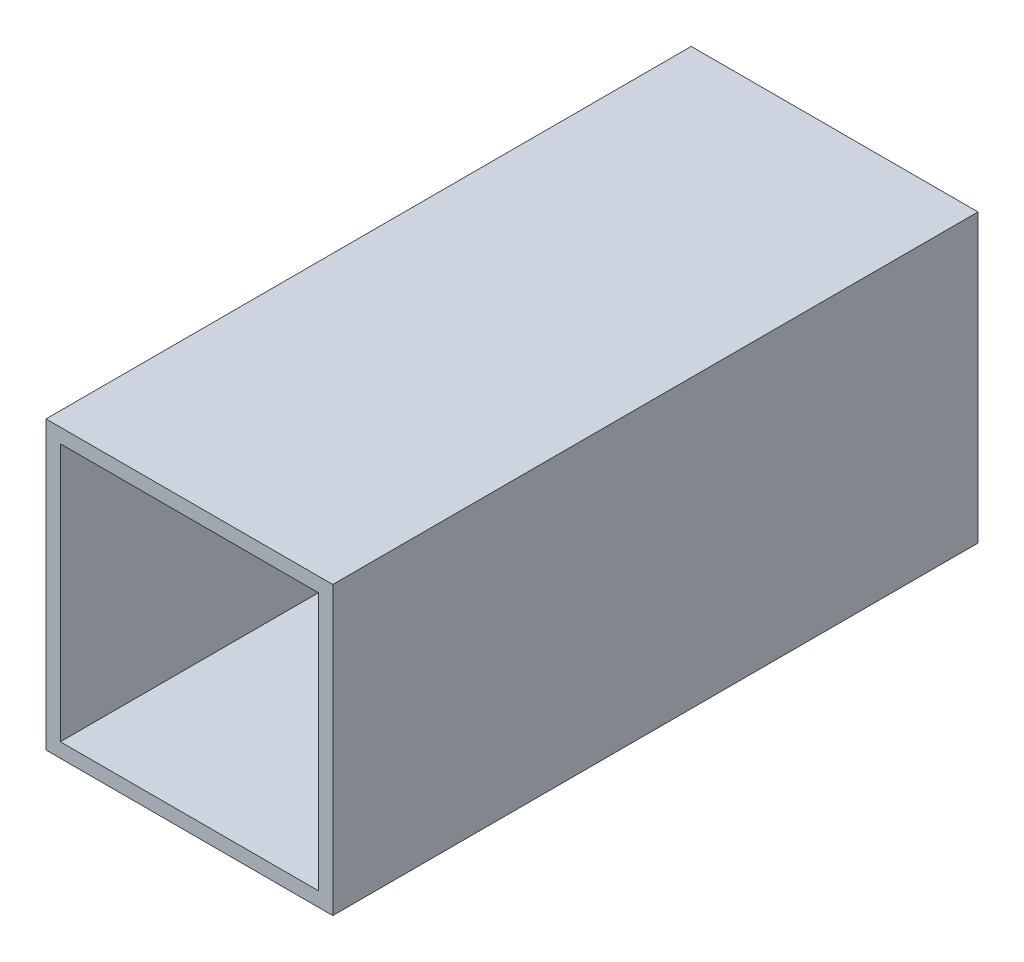
ISO-10303-21;
HEADER;
FILE_DESCRIPTION(('STEP AP214'),'2;1');
FILE_NAME('part.step','',(''),(''),'','','');
FILE_SCHEMA(('AUTOMOTIVE_DESIGN { 1 0 10303 214 1 1 1 1 }'));
ENDSEC;
DATA;
#1=APPLICATION_CONTEXT('core data for automotive mechanical design processes');
#2=APPLICATION_PROTOCOL_DEFINITION('international standard','automotive_design',2000,#1);
#3=PRODUCT_CONTEXT('',#1,'mechanical');
#4=PRODUCT('Part','Part','',(#3));
#5=PRODUCT_RELATED_PRODUCT_CATEGORY('part','',(#4));
#6=PRODUCT_DEFINITION_FORMATION('','',#4);
#7=PRODUCT_DEFINITION_CONTEXT('part definition',#1,'design');
#8=PRODUCT_DEFINITION('design','',#6,#7);
#9=PRODUCT_DEFINITION_SHAPE('','',#8);
#10=(LENGTH_UNIT() NAMED_UNIT(*) SI_UNIT(.MILLI.,.METRE.));
#11=(NAMED_UNIT(*) PLANE_ANGLE_UNIT() SI_UNIT($,.RADIAN.));
#12=(NAMED_UNIT(*) SI_UNIT($,.STERADIAN.) SOLID_ANGLE_UNIT());
#13=UNCERTAINTY_MEASURE_WITH_UNIT(LENGTH_MEASURE(1.E-05),#10,'distance_accuracy_value','');
#14=(GEOMETRIC_REPRESENTATION_CONTEXT(3) GLOBAL_UNCERTAINTY_ASSIGNED_CONTEXT((#13)) GLOBAL_UNIT_ASSIGNED_CONTEXT((#10,
#11,#12)) REPRESENTATION_CONTEXT('',''));
#15=CARTESIAN_POINT('',(0.,0.,0.));
#16=DIRECTION('',(0.,0.,1.));
#17=DIRECTION('',(1.,0.,0.));
#18=AXIS2_PLACEMENT_3D('',#15,#16,#17);
#19=CARTESIAN_POINT('',(0.,0.,114.3));
#20=DIRECTION('',(0.,0.,-1.));
#21=DIRECTION('',(-1.,0.,0.));
#22=AXIS2_PLACEMENT_3D('',#19,#20,#21);
#23=PLANE('',#22);
#24=DIRECTION('',(0.,-1.,0.));
#25=VECTOR('',#24,1.);
#26=CARTESIAN_POINT('',(1.63285714285714,0.,114.3));
#27=LINE('',#26,#25);
#28=CARTESIAN_POINT('',(1.63285714285714,50.8,114.3));
#29=VERTEX_POINT('',#28);
#30=CARTESIAN_POINT('',(1.63285714285714,0.,114.3));
#31=VERTEX_POINT('',#30);
#32=EDGE_CURVE('E134',#29,#31,#27,.T.);
#33=ORIENTED_EDGE('',*,*,#32,.T.);
#34=DIRECTION('',(1.,0.,0.));
#35=VECTOR('',#34,1.);
#36=CARTESIAN_POINT('',(1.63285714285714,0.,114.3));
#37=LINE('',#36,#35);
#38=CARTESIAN_POINT('',(52.4328571428571,0.,114.3));
#39=VERTEX_POINT('',#38);
#40=EDGE_CURVE('E137',#31,#39,#37,.T.);
#41=ORIENTED_EDGE('',*,*,#40,.T.);
#42=DIRECTION('',(0.,1.,0.));
#43=VECTOR('',#42,1.);
#44=CARTESIAN_POINT('',(52.4328571428571,0.,114.3));
#45=LINE('',#44,#43);
#46=CARTESIAN_POINT('',(52.4328571428571,50.8,114.3));
#47=VERTEX_POINT('',#46);
#48=EDGE_CURVE('E140',#39,#47,#45,.T.);
#49=ORIENTED_EDGE('',*,*,#48,.T.);
#50=DIRECTION('',(-1.,0.,0.));
#51=VECTOR('',#50,1.);
#52=CARTESIAN_POINT('',(1.63285714285714,50.8,114.3));
#53=LINE('',#52,#51);
#54=EDGE_CURVE('E142',#47,#29,#53,.T.);
#55=ORIENTED_EDGE('',*,*,#54,.T.);
#56=EDGE_LOOP('',(#33,#41,#49,#55));
#57=FACE_BOUND('',#56,.T.);
#58=DIRECTION('',(0.,-1.,0.));
#59=VECTOR('',#58,1.);
#60=CARTESIAN_POINT('',(4.17285714285714,2.54,114.3));
#61=LINE('',#60,#59);
#62=CARTESIAN_POINT('',(4.17285714285714,48.26,114.3));
#63=VERTEX_POINT('',#62);
#64=CARTESIAN_POINT('',(4.17285714285714,2.54,114.3));
#65=VERTEX_POINT('',#64);
#66=EDGE_CURVE('E98',#63,#65,#61,.T.);
#67=ORIENTED_EDGE('',*,*,#66,.F.);
#68=DIRECTION('',(-1.,0.,0.));
#69=VECTOR('',#68,1.);
#70=CARTESIAN_POINT('',(4.17285714285714,48.26,114.3));
#71=LINE('',#70,#69);
#72=CARTESIAN_POINT('',(49.8928571428571,48.26,114.3));
#73=VERTEX_POINT('',#72);
#74=EDGE_CURVE('E120',#73,#63,#71,.T.);
#75=ORIENTED_EDGE('',*,*,#74,.F.);
#76=DIRECTION('',(0.,1.,0.));
#77=VECTOR('',#76,1.);
#78=CARTESIAN_POINT('',(49.8928571428571,2.54,114.3));
#79=LINE('',#78,#77);
#80=CARTESIAN_POINT('',(49.8928571428571,2.54,114.3));
#81=VERTEX_POINT('',#80);
#82=EDGE_CURVE('E118',#81,#73,#79,.T.);
#83=ORIENTED_EDGE('',*,*,#82,.F.);
#84=DIRECTION('',(1.,0.,0.));
#85=VECTOR('',#84,1.);
#86=CARTESIAN_POINT('',(4.17285714285714,2.54,114.3));
#87=LINE('',#86,#85);
#88=EDGE_CURVE('E106',#65,#81,#87,.T.);
#89=ORIENTED_EDGE('',*,*,#88,.F.);
#90=EDGE_LOOP('',(#67,#75,#83,#89));
#91=FACE_BOUND('',#90,.T.);
#92=ADVANCED_FACE('F33',(#57,#91),#23,.F.);
#93=CARTESIAN_POINT('',(0.,0.,0.));
#94=DIRECTION('',(0.,0.,-1.));
#95=DIRECTION('',(-1.,0.,0.));
#96=AXIS2_PLACEMENT_3D('',#93,#94,#95);
#97=PLANE('',#96);
#98=DIRECTION('',(0.,-1.,0.));
#99=VECTOR('',#98,1.);
#100=CARTESIAN_POINT('',(1.63285714285714,0.,0.));
#101=LINE('',#100,#99);
#102=CARTESIAN_POINT('',(1.63285714285714,50.8,0.));
#103=VERTEX_POINT('',#102);
#104=CARTESIAN_POINT('',(1.63285714285714,0.,0.));
#105=VERTEX_POINT('',#104);
#106=EDGE_CURVE('E114',#103,#105,#101,.T.);
#107=ORIENTED_EDGE('',*,*,#106,.F.);
#108=DIRECTION('',(-1.,0.,0.));
#109=VECTOR('',#108,1.);
#110=CARTESIAN_POINT('',(1.63285714285714,50.8,0.));
#111=LINE('',#110,#109);
#112=CARTESIAN_POINT('',(52.4328571428571,50.8,0.));
#113=VERTEX_POINT('',#112);
#114=EDGE_CURVE('E138',#113,#103,#111,.T.);
#115=ORIENTED_EDGE('',*,*,#114,.F.);
#116=DIRECTION('',(0.,1.,0.));
#117=VECTOR('',#116,1.);
#118=CARTESIAN_POINT('',(52.4328571428571,0.,0.));
#119=LINE('',#118,#117);
#120=CARTESIAN_POINT('',(52.4328571428571,0.,0.));
#121=VERTEX_POINT('',#120);
#122=EDGE_CURVE('E149',#121,#113,#119,.T.);
#123=ORIENTED_EDGE('',*,*,#122,.F.);
#124=DIRECTION('',(1.,0.,0.));
#125=VECTOR('',#124,1.);
#126=CARTESIAN_POINT('',(1.63285714285714,0.,0.));
#127=LINE('',#126,#125);
#128=EDGE_CURVE('E147',#105,#121,#127,.T.);
#129=ORIENTED_EDGE('',*,*,#128,.F.);
#130=EDGE_LOOP('',(#107,#115,#123,#129));
#131=FACE_BOUND('',#130,.T.);
#132=DIRECTION('',(-1.,0.,0.));
#133=VECTOR('',#132,1.);
#134=CARTESIAN_POINT('',(4.17285714285714,48.26,0.));
#135=LINE('',#134,#133);
#136=CARTESIAN_POINT('',(49.8928571428571,48.26,0.));
#137=VERTEX_POINT('',#136);
#138=CARTESIAN_POINT('',(4.17285714285714,48.26,0.));
#139=VERTEX_POINT('',#138);
#140=EDGE_CURVE('E107',#137,#139,#135,.T.);
#141=ORIENTED_EDGE('',*,*,#140,.T.);
#142=DIRECTION('',(0.,-1.,0.));
#143=VECTOR('',#142,1.);
#144=CARTESIAN_POINT('',(4.17285714285714,2.54,0.));
#145=LINE('',#144,#143);
#146=CARTESIAN_POINT('',(4.17285714285714,2.54,0.));
#147=VERTEX_POINT('',#146);
#148=EDGE_CURVE('E56',#139,#147,#145,.T.);
#149=ORIENTED_EDGE('',*,*,#148,.T.);
#150=DIRECTION('',(1.,0.,0.));
#151=VECTOR('',#150,1.);
#152=CARTESIAN_POINT('',(4.17285714285714,2.54,0.));
#153=LINE('',#152,#151);
#154=CARTESIAN_POINT('',(49.8928571428571,2.54,0.));
#155=VERTEX_POINT('',#154);
#156=EDGE_CURVE('E113',#147,#155,#153,.T.);
#157=ORIENTED_EDGE('',*,*,#156,.T.);
#158=DIRECTION('',(0.,1.,0.));
#159=VECTOR('',#158,1.);
#160=CARTESIAN_POINT('',(49.8928571428571,2.54,0.));
#161=LINE('',#160,#159);
#162=EDGE_CURVE('E126',#155,#137,#161,.T.);
#163=ORIENTED_EDGE('',*,*,#162,.T.);
#164=EDGE_LOOP('',(#141,#149,#157,#163));
#165=FACE_BOUND('',#164,.T.);
#166=ADVANCED_FACE('F167',(#131,#165),#97,.T.);
#167=CARTESIAN_POINT('',(1.63285714285714,0.,114.3));
#168=DIRECTION('',(1.,0.,0.));
#169=DIRECTION('',(0.,0.,-1.));
#170=AXIS2_PLACEMENT_3D('',#167,#168,#169);
#171=PLANE('',#170);
#172=ORIENTED_EDGE('',*,*,#106,.T.);
#173=DIRECTION('',(0.,0.,-1.));
#174=VECTOR('',#173,1.);
#175=CARTESIAN_POINT('',(1.63285714285714,0.,114.3));
#176=LINE('',#175,#174);
#177=EDGE_CURVE('E11',#31,#105,#176,.T.);
#178=ORIENTED_EDGE('',*,*,#177,.F.);
#179=ORIENTED_EDGE('',*,*,#32,.F.);
#180=DIRECTION('',(0.,0.,-1.));
#181=VECTOR('',#180,1.);
#182=CARTESIAN_POINT('',(1.63285714285714,50.8,114.3));
#183=LINE('',#182,#181);
#184=EDGE_CURVE('E144',#29,#103,#183,.T.);
#185=ORIENTED_EDGE('',*,*,#184,.T.);
#186=EDGE_LOOP('',(#172,#178,#179,#185));
#187=FACE_BOUND('',#186,.T.);
#188=ADVANCED_FACE('F35',(#187),#171,.F.);
#189=CARTESIAN_POINT('',(1.63285714285714,0.,114.3));
#190=DIRECTION('',(0.,1.,0.));
#191=DIRECTION('',(0.,0.,1.));
#192=AXIS2_PLACEMENT_3D('',#189,#190,#191);
#193=PLANE('',#192);
#194=ORIENTED_EDGE('',*,*,#128,.T.);
#195=DIRECTION('',(0.,0.,-1.));
#196=VECTOR('',#195,1.);
#197=CARTESIAN_POINT('',(52.4328571428571,0.,114.3));
#198=LINE('',#197,#196);
#199=EDGE_CURVE('E41',#39,#121,#198,.T.);
#200=ORIENTED_EDGE('',*,*,#199,.F.);
#201=ORIENTED_EDGE('',*,*,#40,.F.);
#202=ORIENTED_EDGE('',*,*,#177,.T.);
#203=EDGE_LOOP('',(#194,#200,#201,#202));
#204=FACE_BOUND('',#203,.T.);
#205=ADVANCED_FACE('F177',(#204),#193,.F.);
#206=CARTESIAN_POINT('',(52.4328571428571,0.,114.3));
#207=DIRECTION('',(-1.,0.,0.));
#208=DIRECTION('',(0.,0.,1.));
#209=AXIS2_PLACEMENT_3D('',#206,#207,#208);
#210=PLANE('',#209);
#211=ORIENTED_EDGE('',*,*,#122,.T.);
#212=DIRECTION('',(0.,0.,-1.));
#213=VECTOR('',#212,1.);
#214=CARTESIAN_POINT('',(52.4328571428571,50.8,114.3));
#215=LINE('',#214,#213);
#216=EDGE_CURVE('E154',#47,#113,#215,.T.);
#217=ORIENTED_EDGE('',*,*,#216,.F.);
#218=ORIENTED_EDGE('',*,*,#48,.F.);
#219=ORIENTED_EDGE('',*,*,#199,.T.);
#220=EDGE_LOOP('',(#211,#217,#218,#219));
#221=FACE_BOUND('',#220,.T.);
#222=ADVANCED_FACE('F161',(#221),#210,.F.);
#223=CARTESIAN_POINT('',(1.63285714285714,50.8,114.3));
#224=DIRECTION('',(0.,-1.,0.));
#225=DIRECTION('',(0.,0.,-1.));
#226=AXIS2_PLACEMENT_3D('',#223,#224,#225);
#227=PLANE('',#226);
#228=ORIENTED_EDGE('',*,*,#114,.T.);
#229=ORIENTED_EDGE('',*,*,#184,.F.);
#230=ORIENTED_EDGE('',*,*,#54,.F.);
#231=ORIENTED_EDGE('',*,*,#216,.T.);
#232=EDGE_LOOP('',(#228,#229,#230,#231));
#233=FACE_BOUND('',#232,.T.);
#234=ADVANCED_FACE('F171',(#233),#227,.F.);
#235=CARTESIAN_POINT('',(4.17285714285714,2.54,114.3));
#236=DIRECTION('',(1.,0.,0.));
#237=DIRECTION('',(0.,0.,-1.));
#238=AXIS2_PLACEMENT_3D('',#235,#236,#237);
#239=PLANE('',#238);
#240=ORIENTED_EDGE('',*,*,#148,.F.);
#241=DIRECTION('',(0.,0.,-1.));
#242=VECTOR('',#241,1.);
#243=CARTESIAN_POINT('',(4.17285714285714,48.26,114.3));
#244=LINE('',#243,#242);
#245=EDGE_CURVE('E102',#63,#139,#244,.T.);
#246=ORIENTED_EDGE('',*,*,#245,.F.);
#247=ORIENTED_EDGE('',*,*,#66,.T.);
#248=DIRECTION('',(0.,0.,-1.));
#249=VECTOR('',#248,1.);
#250=CARTESIAN_POINT('',(4.17285714285714,2.54,114.3));
#251=LINE('',#250,#249);
#252=EDGE_CURVE('E101',#65,#147,#251,.T.);
#253=ORIENTED_EDGE('',*,*,#252,.T.);
#254=EDGE_LOOP('',(#240,#246,#247,#253));
#255=FACE_BOUND('',#254,.T.);
#256=ADVANCED_FACE('F100',(#255),#239,.T.);
#257=CARTESIAN_POINT('',(4.17285714285714,2.54,114.3));
#258=DIRECTION('',(0.,1.,0.));
#259=DIRECTION('',(0.,0.,1.));
#260=AXIS2_PLACEMENT_3D('',#257,#258,#259);
#261=PLANE('',#260);
#262=ORIENTED_EDGE('',*,*,#156,.F.);
#263=ORIENTED_EDGE('',*,*,#252,.F.);
#264=ORIENTED_EDGE('',*,*,#88,.T.);
#265=DIRECTION('',(0.,0.,-1.));
#266=VECTOR('',#265,1.);
#267=CARTESIAN_POINT('',(49.8928571428571,2.54,114.3));
#268=LINE('',#267,#266);
#269=EDGE_CURVE('E115',#81,#155,#268,.T.);
#270=ORIENTED_EDGE('',*,*,#269,.T.);
#271=EDGE_LOOP('',(#262,#263,#264,#270));
#272=FACE_BOUND('',#271,.T.);
#273=ADVANCED_FACE('F110',(#272),#261,.T.);
#274=CARTESIAN_POINT('',(49.8928571428571,2.54,114.3));
#275=DIRECTION('',(-1.,0.,0.));
#276=DIRECTION('',(0.,0.,1.));
#277=AXIS2_PLACEMENT_3D('',#274,#275,#276);
#278=PLANE('',#277);
#279=ORIENTED_EDGE('',*,*,#162,.F.);
#280=ORIENTED_EDGE('',*,*,#269,.F.);
#281=ORIENTED_EDGE('',*,*,#82,.T.);
#282=DIRECTION('',(0.,0.,-1.));
#283=VECTOR('',#282,1.);
#284=CARTESIAN_POINT('',(49.8928571428571,48.26,114.3));
#285=LINE('',#284,#283);
#286=EDGE_CURVE('E48',#73,#137,#285,.T.);
#287=ORIENTED_EDGE('',*,*,#286,.T.);
#288=EDGE_LOOP('',(#279,#280,#281,#287));
#289=FACE_BOUND('',#288,.T.);
#290=ADVANCED_FACE('F200',(#289),#278,.T.);
#291=CARTESIAN_POINT('',(4.17285714285714,48.26,114.3));
#292=DIRECTION('',(0.,-1.,0.));
#293=DIRECTION('',(0.,0.,-1.));
#294=AXIS2_PLACEMENT_3D('',#291,#292,#293);
#295=PLANE('',#294);
#296=ORIENTED_EDGE('',*,*,#140,.F.);
#297=ORIENTED_EDGE('',*,*,#286,.F.);
#298=ORIENTED_EDGE('',*,*,#74,.T.);
#299=ORIENTED_EDGE('',*,*,#245,.T.);
#300=EDGE_LOOP('',(#296,#297,#298,#299));
#301=FACE_BOUND('',#300,.T.);
#302=ADVANCED_FACE('F204',(#301),#295,.T.);
#303=CLOSED_SHELL('',(#92,#166,#188,#205,#222,#234,#256,#273,#290,#302));
#304=MANIFOLD_SOLID_BREP('B2',#303);
#305=ADVANCED_BREP_SHAPE_REPRESENTATION('',(#18,#304),#14);
#306=SHAPE_DEFINITION_REPRESENTATION(#9,#305);
ENDSEC;
END-ISO-10303-21;
